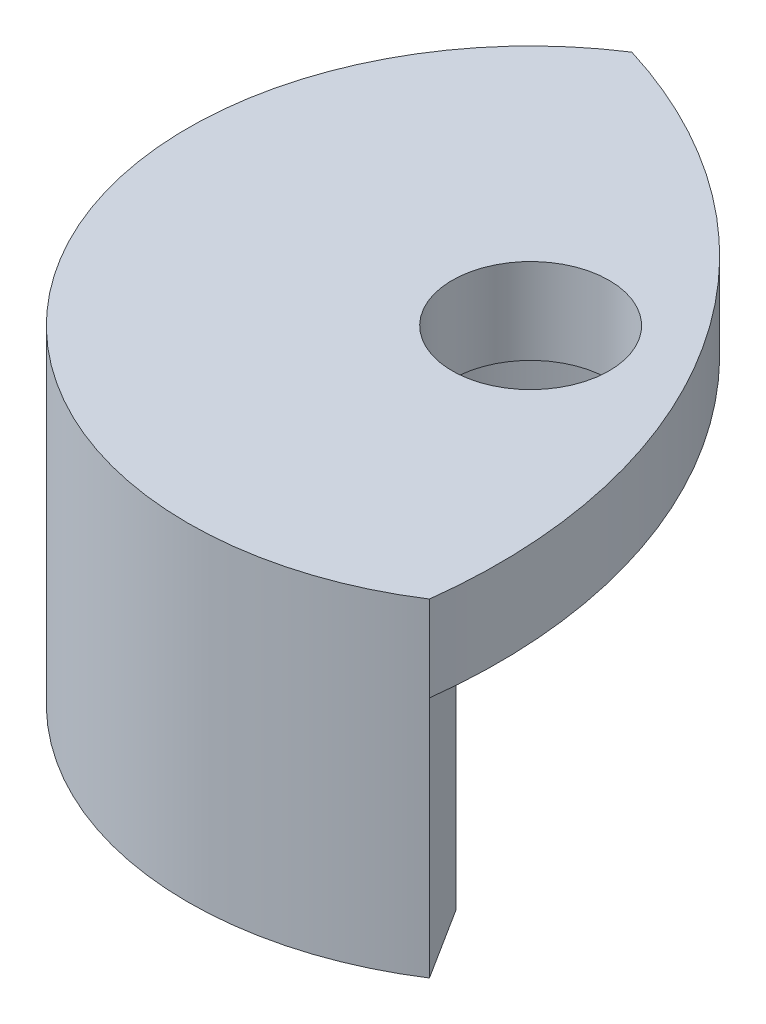
ISO-10303-21;
HEADER;
FILE_DESCRIPTION(('STEP AP214'),'2;1');
FILE_NAME('part.step','',(''),(''),'','','');
FILE_SCHEMA(('AUTOMOTIVE_DESIGN { 1 0 10303 214 1 1 1 1 }'));
ENDSEC;
DATA;
#1=APPLICATION_CONTEXT('core data for automotive mechanical design processes');
#2=APPLICATION_PROTOCOL_DEFINITION('international standard','automotive_design',2000,#1);
#3=PRODUCT_CONTEXT('',#1,'mechanical');
#4=PRODUCT('Part','Part','',(#3));
#5=PRODUCT_RELATED_PRODUCT_CATEGORY('part','',(#4));
#6=PRODUCT_DEFINITION_FORMATION('','',#4);
#7=PRODUCT_DEFINITION_CONTEXT('part definition',#1,'design');
#8=PRODUCT_DEFINITION('design','',#6,#7);
#9=PRODUCT_DEFINITION_SHAPE('','',#8);
#10=(LENGTH_UNIT() NAMED_UNIT(*) SI_UNIT(.MILLI.,.METRE.));
#11=(NAMED_UNIT(*) PLANE_ANGLE_UNIT() SI_UNIT($,.RADIAN.));
#12=(NAMED_UNIT(*) SI_UNIT($,.STERADIAN.) SOLID_ANGLE_UNIT());
#13=UNCERTAINTY_MEASURE_WITH_UNIT(LENGTH_MEASURE(1.E-05),#10,'distance_accuracy_value','');
#14=(GEOMETRIC_REPRESENTATION_CONTEXT(3) GLOBAL_UNCERTAINTY_ASSIGNED_CONTEXT((#13)) GLOBAL_UNIT_ASSIGNED_CONTEXT((#10,
#11,#12)) REPRESENTATION_CONTEXT('',''));
#15=CARTESIAN_POINT('',(0.,0.,0.));
#16=DIRECTION('',(0.,0.,1.));
#17=DIRECTION('',(1.,0.,0.));
#18=AXIS2_PLACEMENT_3D('',#15,#16,#17);
#19=CARTESIAN_POINT('',(-13.0505856141717,17.,-20.1415544367155));
#20=DIRECTION('',(-0.845130838732514,0.,0.534559505970362));
#21=DIRECTION('',(0.534559505970362,0.,0.845130838732514));
#22=AXIS2_PLACEMENT_3D('',#19,#20,#21);
#23=PLANE('',#22);
#24=DIRECTION('',(0.,1.,0.));
#25=VECTOR('',#24,1.);
#26=CARTESIAN_POINT('',(-9.84297257053777,-50.9116882454318,-15.070364659677));
#27=LINE('',#26,#25);
#28=CARTESIAN_POINT('',(-9.84297257053777,-3.45790560791E-13,-15.070364659677));
#29=VERTEX_POINT('',#28);
#30=CARTESIAN_POINT('',(-9.84297257053777,17.,-15.070364659677));
#31=VERTEX_POINT('',#30);
#32=EDGE_CURVE('E128',#29,#31,#27,.T.);
#33=ORIENTED_EDGE('',*,*,#32,.F.);
#34=DIRECTION('',(-0.534559505970362,0.,-0.845130838732514));
#35=VECTOR('',#34,1.);
#36=CARTESIAN_POINT('',(-13.0505856141717,0.,-20.1415544367155));
#37=LINE('',#36,#35);
#38=CARTESIAN_POINT('',(-13.0505856141717,0.,-20.1415544367155));
#39=VERTEX_POINT('',#38);
#40=EDGE_CURVE('E76',#29,#39,#37,.T.);
#41=ORIENTED_EDGE('',*,*,#40,.T.);
#42=DIRECTION('',(0.,-1.,0.));
#43=VECTOR('',#42,1.);
#44=CARTESIAN_POINT('',(-13.0505856141717,17.,-20.1415544367155));
#45=LINE('',#44,#43);
#46=CARTESIAN_POINT('',(-13.0505856141717,17.,-20.1415544367155));
#47=VERTEX_POINT('',#46);
#48=EDGE_CURVE('E11',#47,#39,#45,.T.);
#49=ORIENTED_EDGE('',*,*,#48,.F.);
#50=DIRECTION('',(-0.534559505970362,0.,-0.845130838732514));
#51=VECTOR('',#50,1.);
#52=CARTESIAN_POINT('',(-13.0505856141717,17.,-20.1415544367155));
#53=LINE('',#52,#51);
#54=EDGE_CURVE('E87',#31,#47,#53,.T.);
#55=ORIENTED_EDGE('',*,*,#54,.F.);
#56=EDGE_LOOP('',(#33,#41,#49,#55));
#57=FACE_BOUND('',#56,.T.);
#58=ADVANCED_FACE('F35',(#57),#23,.F.);
#59=CARTESIAN_POINT('',(8.2390892319083,17.,12.5346483248894));
#60=DIRECTION('',(-0.845130838732514,0.,0.534559505970362));
#61=DIRECTION('',(0.534559505970362,0.,0.845130838732514));
#62=AXIS2_PLACEMENT_3D('',#59,#60,#61);
#63=PLANE('',#62);
#64=DIRECTION('',(0.,1.,0.));
#65=VECTOR('',#64,1.);
#66=CARTESIAN_POINT('',(9.84297257053777,-50.9116882454318,15.070364659677));
#67=LINE('',#66,#65);
#68=CARTESIAN_POINT('',(9.84297257053777,17.,15.070364659677));
#69=VERTEX_POINT('',#68);
#70=CARTESIAN_POINT('',(9.84297257053777,0.,15.070364659677));
#71=VERTEX_POINT('',#70);
#72=EDGE_CURVE('E49',#69,#71,#67,.F.);
#73=ORIENTED_EDGE('',*,*,#72,.F.);
#74=DIRECTION('',(-0.534559505970362,0.,-0.845130838732514));
#75=VECTOR('',#74,1.);
#76=CARTESIAN_POINT('',(8.2390892319083,17.,12.5346483248894));
#77=LINE('',#76,#75);
#78=CARTESIAN_POINT('',(13.0505856141717,17.,20.1415544367155));
#79=VERTEX_POINT('',#78);
#80=EDGE_CURVE('E82',#79,#69,#77,.T.);
#81=ORIENTED_EDGE('',*,*,#80,.F.);
#82=DIRECTION('',(0.,-1.,0.));
#83=VECTOR('',#82,1.);
#84=CARTESIAN_POINT('',(13.0505856141717,17.,20.1415544367155));
#85=LINE('',#84,#83);
#86=CARTESIAN_POINT('',(13.0505856141717,0.,20.1415544367155));
#87=VERTEX_POINT('',#86);
#88=EDGE_CURVE('E42',#79,#87,#85,.T.);
#89=ORIENTED_EDGE('',*,*,#88,.T.);
#90=DIRECTION('',(-0.534559505970362,0.,-0.845130838732514));
#91=VECTOR('',#90,1.);
#92=CARTESIAN_POINT('',(8.2390892319083,0.,12.5346483248894));
#93=LINE('',#92,#91);
#94=EDGE_CURVE('E75',#87,#71,#93,.T.);
#95=ORIENTED_EDGE('',*,*,#94,.T.);
#96=EDGE_LOOP('',(#73,#81,#89,#95));
#97=FACE_BOUND('',#96,.T.);
#98=ADVANCED_FACE('F80',(#97),#63,.F.);
#99=CARTESIAN_POINT('',(0.,17.,0.));
#100=DIRECTION('',(0.,-1.,0.));
#101=DIRECTION('',(0.,0.,-1.));
#102=AXIS2_PLACEMENT_3D('',#99,#100,#101);
#103=CYLINDRICAL_SURFACE('',#102,24.);
#104=CARTESIAN_POINT('',(0.,0.,0.));
#105=DIRECTION('',(0.,1.,0.));
#106=DIRECTION('',(0.,0.,1.));
#107=AXIS2_PLACEMENT_3D('',#104,#105,#106);
#108=CIRCLE('',#107,24.);
#109=EDGE_CURVE('E68',#39,#87,#108,.T.);
#110=ORIENTED_EDGE('',*,*,#109,.T.);
#111=ORIENTED_EDGE('',*,*,#88,.F.);
#112=DIRECTION('',(0.,-1.,0.));
#113=VECTOR('',#112,1.);
#114=CARTESIAN_POINT('',(13.0505856141717,23.,20.1415544367155));
#115=LINE('',#114,#113);
#116=CARTESIAN_POINT('',(13.0505856141717,23.,20.1415544367155));
#117=VERTEX_POINT('',#116);
#118=EDGE_CURVE('E96',#117,#79,#115,.T.);
#119=ORIENTED_EDGE('',*,*,#118,.F.);
#120=CARTESIAN_POINT('',(0.,23.,0.));
#121=DIRECTION('',(0.,1.,0.));
#122=DIRECTION('',(0.,0.,-1.));
#123=AXIS2_PLACEMENT_3D('',#120,#121,#122);
#124=CIRCLE('',#123,24.);
#125=CARTESIAN_POINT('',(-13.0505856141717,23.,-20.1415544367155));
#126=VERTEX_POINT('',#125);
#127=EDGE_CURVE('E98',#126,#117,#124,.T.);
#128=ORIENTED_EDGE('',*,*,#127,.F.);
#129=DIRECTION('',(0.,-1.,0.));
#130=VECTOR('',#129,1.);
#131=CARTESIAN_POINT('',(-13.0505856141717,23.,-20.1415544367155));
#132=LINE('',#131,#130);
#133=EDGE_CURVE('E93',#126,#47,#132,.T.);
#134=ORIENTED_EDGE('',*,*,#133,.T.);
#135=ORIENTED_EDGE('',*,*,#48,.T.);
#136=EDGE_LOOP('',(#110,#111,#119,#128,#134,#135));
#137=FACE_BOUND('',#136,.T.);
#138=ADVANCED_FACE('F69',(#137),#103,.T.);
#139=CARTESIAN_POINT('',(0.,0.,0.));
#140=DIRECTION('',(0.,1.,0.));
#141=DIRECTION('',(0.,0.,1.));
#142=AXIS2_PLACEMENT_3D('',#139,#140,#141);
#143=PLANE('',#142);
#144=CARTESIAN_POINT('',(0.,-3.33066907387547E-13,0.));
#145=DIRECTION('',(0.,1.,0.));
#146=DIRECTION('',(-1.,0.,0.));
#147=AXIS2_PLACEMENT_3D('',#144,#145,#146);
#148=CIRCLE('',#147,18.);
#149=EDGE_CURVE('E86',#29,#71,#148,.T.);
#150=ORIENTED_EDGE('',*,*,#149,.T.);
#151=ORIENTED_EDGE('',*,*,#94,.F.);
#152=ORIENTED_EDGE('',*,*,#109,.F.);
#153=ORIENTED_EDGE('',*,*,#40,.F.);
#154=EDGE_LOOP('',(#150,#151,#152,#153));
#155=FACE_BOUND('',#154,.T.);
#156=CARTESIAN_POINT('',(-17.4233601637214,0.,-8.75651303917529));
#157=DIRECTION('',(0.,-1.,0.));
#158=DIRECTION('',(0.,0.,-1.));
#159=AXIS2_PLACEMENT_3D('',#156,#157,#158);
#160=CIRCLE('',#159,1.3);
#161=CARTESIAN_POINT('',(-17.4233601637214,0.,-10.0565130391753));
#162=VERTEX_POINT('',#161);
#163=EDGE_CURVE('E120',#162,#162,#160,.T.);
#164=ORIENTED_EDGE('',*,*,#163,.F.);
#165=EDGE_LOOP('',(#164));
#166=FACE_BOUND('',#165,.T.);
#167=CARTESIAN_POINT('',(-16.2950428223562,0.,10.7108160014808));
#168=DIRECTION('',(0.,-1.,0.));
#169=DIRECTION('',(0.,0.,-1.));
#170=AXIS2_PLACEMENT_3D('',#167,#168,#169);
#171=CIRCLE('',#170,1.3);
#172=CARTESIAN_POINT('',(-16.2950428223562,0.,9.41081600148079));
#173=VERTEX_POINT('',#172);
#174=EDGE_CURVE('E114',#173,#173,#171,.T.);
#175=ORIENTED_EDGE('',*,*,#174,.F.);
#176=EDGE_LOOP('',(#175));
#177=FACE_BOUND('',#176,.T.);
#178=CARTESIAN_POINT('',(1.12831734136517,0.,19.4673290406562));
#179=DIRECTION('',(0.,-1.,0.));
#180=DIRECTION('',(0.,0.,-1.));
#181=AXIS2_PLACEMENT_3D('',#178,#179,#180);
#182=CIRCLE('',#181,1.3);
#183=CARTESIAN_POINT('',(1.12831734136517,0.,18.1673290406562));
#184=VERTEX_POINT('',#183);
#185=EDGE_CURVE('E107',#184,#184,#182,.T.);
#186=ORIENTED_EDGE('',*,*,#185,.F.);
#187=EDGE_LOOP('',(#186));
#188=FACE_BOUND('',#187,.T.);
#189=ADVANCED_FACE('F84',(#155,#166,#177,#188),#143,.F.);
#190=CARTESIAN_POINT('',(-23.9992340320051,23.,15.5501433314548));
#191=DIRECTION('',(0.,-1.,0.));
#192=DIRECTION('',(0.,0.,-1.));
#193=AXIS2_PLACEMENT_3D('',#190,#191,#192);
#194=CYLINDRICAL_SURFACE('',#193,37.3332317346321);
#195=CARTESIAN_POINT('',(-23.9992340320051,17.,15.5501433314548));
#196=DIRECTION('',(0.,1.,0.));
#197=DIRECTION('',(0.,0.,1.));
#198=AXIS2_PLACEMENT_3D('',#195,#196,#197);
#199=CIRCLE('',#198,37.3332317346321);
#200=EDGE_CURVE('E99',#79,#47,#199,.T.);
#201=ORIENTED_EDGE('',*,*,#200,.T.);
#202=ORIENTED_EDGE('',*,*,#133,.F.);
#203=CARTESIAN_POINT('',(-23.9992340320051,23.,15.5501433314548));
#204=DIRECTION('',(0.,1.,0.));
#205=DIRECTION('',(0.,0.,1.));
#206=AXIS2_PLACEMENT_3D('',#203,#204,#205);
#207=CIRCLE('',#206,37.3332317346321);
#208=EDGE_CURVE('E101',#117,#126,#207,.T.);
#209=ORIENTED_EDGE('',*,*,#208,.F.);
#210=ORIENTED_EDGE('',*,*,#118,.T.);
#211=EDGE_LOOP('',(#201,#202,#209,#210));
#212=FACE_BOUND('',#211,.T.);
#213=ADVANCED_FACE('F153',(#212),#194,.T.);
#214=CARTESIAN_POINT('',(-11.9996170160026,23.,7.77507166572739));
#215=DIRECTION('',(0.,1.,0.));
#216=DIRECTION('',(0.,0.,1.));
#217=AXIS2_PLACEMENT_3D('',#214,#215,#216);
#218=PLANE('',#217);
#219=CARTESIAN_POINT('',(-1.16876994193937E-13,23.,0.));
#220=DIRECTION('',(0.,-1.,0.));
#221=DIRECTION('',(0.,0.,-1.));
#222=AXIS2_PLACEMENT_3D('',#219,#220,#221);
#223=CIRCLE('',#222,5.5);
#224=CARTESIAN_POINT('',(-1.16876994193937E-13,23.,-5.50000000000009));
#225=VERTEX_POINT('',#224);
#226=EDGE_CURVE('E111',#225,#225,#223,.T.);
#227=ORIENTED_EDGE('',*,*,#226,.T.);
#228=EDGE_LOOP('',(#227));
#229=FACE_BOUND('',#228,.T.);
#230=ORIENTED_EDGE('',*,*,#208,.T.);
#231=ORIENTED_EDGE('',*,*,#127,.T.);
#232=EDGE_LOOP('',(#230,#231));
#233=FACE_BOUND('',#232,.T.);
#234=ADVANCED_FACE('F180',(#229,#233),#218,.T.);
#235=CARTESIAN_POINT('',(-11.9996170160026,17.,7.77507166572739));
#236=DIRECTION('',(0.,1.,0.));
#237=DIRECTION('',(0.,0.,1.));
#238=AXIS2_PLACEMENT_3D('',#235,#236,#237);
#239=PLANE('',#238);
#240=CARTESIAN_POINT('',(0.,17.,0.));
#241=DIRECTION('',(0.,-1.,0.));
#242=DIRECTION('',(0.,0.,-1.));
#243=AXIS2_PLACEMENT_3D('',#240,#241,#242);
#244=CIRCLE('',#243,18.);
#245=EDGE_CURVE('E135',#69,#31,#244,.T.);
#246=ORIENTED_EDGE('',*,*,#245,.T.);
#247=ORIENTED_EDGE('',*,*,#54,.T.);
#248=ORIENTED_EDGE('',*,*,#200,.F.);
#249=ORIENTED_EDGE('',*,*,#80,.T.);
#250=EDGE_LOOP('',(#246,#247,#248,#249));
#251=FACE_BOUND('',#250,.T.);
#252=CARTESIAN_POINT('',(-1.16876994193937E-13,17.,0.));
#253=DIRECTION('',(0.,-1.,0.));
#254=DIRECTION('',(0.,0.,-1.));
#255=AXIS2_PLACEMENT_3D('',#252,#253,#254);
#256=CIRCLE('',#255,5.5);
#257=CARTESIAN_POINT('',(-1.16876994193937E-13,17.,-5.50000000000009));
#258=VERTEX_POINT('',#257);
#259=EDGE_CURVE('E125',#258,#258,#256,.T.);
#260=ORIENTED_EDGE('',*,*,#259,.F.);
#261=EDGE_LOOP('',(#260));
#262=FACE_BOUND('',#261,.T.);
#263=ADVANCED_FACE('F140',(#251,#262),#239,.F.);
#264=CARTESIAN_POINT('',(1.12831734136517,10.,19.4673290406562));
#265=DIRECTION('',(0.,-1.,0.));
#266=DIRECTION('',(0.,0.,-1.));
#267=AXIS2_PLACEMENT_3D('',#264,#265,#266);
#268=CYLINDRICAL_SURFACE('',#267,1.3);
#269=CARTESIAN_POINT('',(1.12831734136517,10.,19.4673290406562));
#270=DIRECTION('',(0.,-1.,0.));
#271=DIRECTION('',(0.,0.,-1.));
#272=AXIS2_PLACEMENT_3D('',#269,#270,#271);
#273=CIRCLE('',#272,1.3);
#274=CARTESIAN_POINT('',(1.12831734136517,10.,18.1673290406562));
#275=VERTEX_POINT('',#274);
#276=EDGE_CURVE('E110',#275,#275,#273,.T.);
#277=ORIENTED_EDGE('',*,*,#276,.F.);
#278=EDGE_LOOP('',(#277));
#279=FACE_BOUND('',#278,.T.);
#280=ORIENTED_EDGE('',*,*,#185,.T.);
#281=EDGE_LOOP('',(#280));
#282=FACE_BOUND('',#281,.T.);
#283=ADVANCED_FACE('F183',(#279,#282),#268,.F.);
#284=CARTESIAN_POINT('',(1.12831734136517,10.,19.4673290406562));
#285=DIRECTION('',(0.,-1.,0.));
#286=DIRECTION('',(0.,0.,-1.));
#287=AXIS2_PLACEMENT_3D('',#284,#285,#286);
#288=PLANE('',#287);
#289=ORIENTED_EDGE('',*,*,#276,.T.);
#290=EDGE_LOOP('',(#289));
#291=FACE_BOUND('',#290,.T.);
#292=ADVANCED_FACE('F189',(#291),#288,.T.);
#293=CARTESIAN_POINT('',(-16.2950428223562,10.,10.7108160014808));
#294=DIRECTION('',(0.,-1.,0.));
#295=DIRECTION('',(0.,0.,-1.));
#296=AXIS2_PLACEMENT_3D('',#293,#294,#295);
#297=CYLINDRICAL_SURFACE('',#296,1.3);
#298=CARTESIAN_POINT('',(-16.2950428223562,10.,10.7108160014808));
#299=DIRECTION('',(0.,-1.,0.));
#300=DIRECTION('',(0.,0.,-1.));
#301=AXIS2_PLACEMENT_3D('',#298,#299,#300);
#302=CIRCLE('',#301,1.3);
#303=CARTESIAN_POINT('',(-16.2950428223562,10.,9.41081600148079));
#304=VERTEX_POINT('',#303);
#305=EDGE_CURVE('E117',#304,#304,#302,.T.);
#306=ORIENTED_EDGE('',*,*,#305,.F.);
#307=EDGE_LOOP('',(#306));
#308=FACE_BOUND('',#307,.T.);
#309=ORIENTED_EDGE('',*,*,#174,.T.);
#310=EDGE_LOOP('',(#309));
#311=FACE_BOUND('',#310,.T.);
#312=ADVANCED_FACE('F193',(#308,#311),#297,.F.);
#313=CARTESIAN_POINT('',(-16.2950428223562,10.,10.7108160014808));
#314=DIRECTION('',(0.,-1.,0.));
#315=DIRECTION('',(0.,0.,-1.));
#316=AXIS2_PLACEMENT_3D('',#313,#314,#315);
#317=PLANE('',#316);
#318=ORIENTED_EDGE('',*,*,#305,.T.);
#319=EDGE_LOOP('',(#318));
#320=FACE_BOUND('',#319,.T.);
#321=ADVANCED_FACE('F197',(#320),#317,.T.);
#322=CARTESIAN_POINT('',(-17.4233601637214,10.,-8.75651303917529));
#323=DIRECTION('',(0.,-1.,0.));
#324=DIRECTION('',(0.,0.,-1.));
#325=AXIS2_PLACEMENT_3D('',#322,#323,#324);
#326=CYLINDRICAL_SURFACE('',#325,1.3);
#327=CARTESIAN_POINT('',(-17.4233601637214,10.,-8.75651303917529));
#328=DIRECTION('',(0.,-1.,0.));
#329=DIRECTION('',(0.,0.,-1.));
#330=AXIS2_PLACEMENT_3D('',#327,#328,#329);
#331=CIRCLE('',#330,1.3);
#332=CARTESIAN_POINT('',(-17.4233601637214,10.,-10.0565130391753));
#333=VERTEX_POINT('',#332);
#334=EDGE_CURVE('E102',#333,#333,#331,.T.);
#335=ORIENTED_EDGE('',*,*,#334,.F.);
#336=EDGE_LOOP('',(#335));
#337=FACE_BOUND('',#336,.T.);
#338=ORIENTED_EDGE('',*,*,#163,.T.);
#339=EDGE_LOOP('',(#338));
#340=FACE_BOUND('',#339,.T.);
#341=ADVANCED_FACE('F201',(#337,#340),#326,.F.);
#342=CARTESIAN_POINT('',(-17.4233601637214,10.,-8.75651303917529));
#343=DIRECTION('',(0.,-1.,0.));
#344=DIRECTION('',(0.,0.,-1.));
#345=AXIS2_PLACEMENT_3D('',#342,#343,#344);
#346=PLANE('',#345);
#347=ORIENTED_EDGE('',*,*,#334,.T.);
#348=EDGE_LOOP('',(#347));
#349=FACE_BOUND('',#348,.T.);
#350=ADVANCED_FACE('F164',(#349),#346,.T.);
#351=CARTESIAN_POINT('',(-1.16876994193937E-13,23.,0.));
#352=DIRECTION('',(0.,-1.,0.));
#353=DIRECTION('',(0.,0.,-1.));
#354=AXIS2_PLACEMENT_3D('',#351,#352,#353);
#355=CYLINDRICAL_SURFACE('',#354,5.5);
#356=ORIENTED_EDGE('',*,*,#226,.F.);
#357=EDGE_LOOP('',(#356));
#358=FACE_BOUND('',#357,.T.);
#359=ORIENTED_EDGE('',*,*,#259,.T.);
#360=EDGE_LOOP('',(#359));
#361=FACE_BOUND('',#360,.T.);
#362=ADVANCED_FACE('F159',(#358,#361),#355,.F.);
#363=CARTESIAN_POINT('',(0.,-50.9116882454318,0.));
#364=DIRECTION('',(0.,1.,0.));
#365=DIRECTION('',(0.,0.,1.));
#366=AXIS2_PLACEMENT_3D('',#363,#364,#365);
#367=CYLINDRICAL_SURFACE('',#366,18.);
#368=ORIENTED_EDGE('',*,*,#32,.T.);
#369=ORIENTED_EDGE('',*,*,#245,.F.);
#370=ORIENTED_EDGE('',*,*,#72,.T.);
#371=ORIENTED_EDGE('',*,*,#149,.F.);
#372=EDGE_LOOP('',(#368,#369,#370,#371));
#373=FACE_BOUND('',#372,.T.);
#374=ADVANCED_FACE('F157',(#373),#367,.F.);
#375=CLOSED_SHELL('',(#58,#98,#138,#189,#213,#234,#263,#283,#292,#312,#321,#341,#350,#362,#374));
#376=MANIFOLD_SOLID_BREP('B2',#375);
#377=ADVANCED_BREP_SHAPE_REPRESENTATION('',(#18,#376),#14);
#378=SHAPE_DEFINITION_REPRESENTATION(#9,#377);
ENDSEC;
END-ISO-10303-21;
